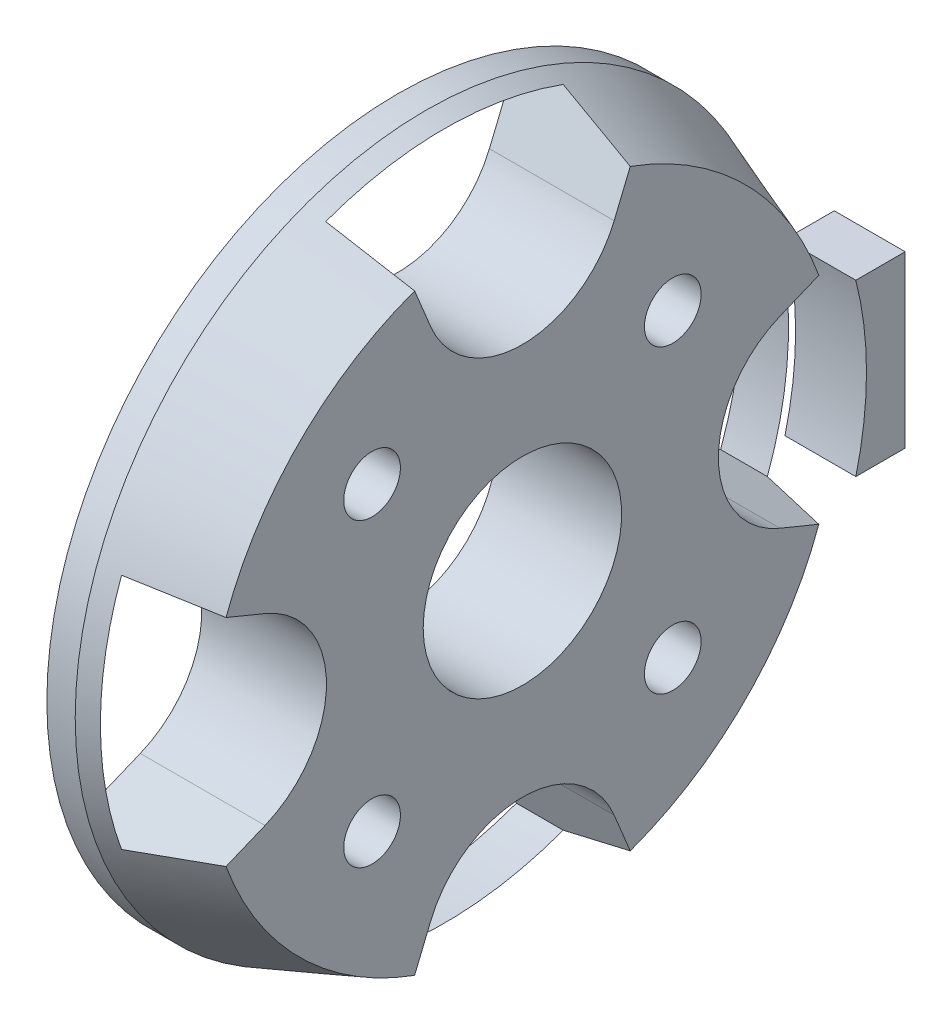
ISO-10303-21;
HEADER;
FILE_DESCRIPTION(('STEP AP214'),'2;1');
FILE_NAME('part.step','',(''),(''),'','','');
FILE_SCHEMA(('AUTOMOTIVE_DESIGN { 1 0 10303 214 1 1 1 1 }'));
ENDSEC;
DATA;
#1=APPLICATION_CONTEXT('core data for automotive mechanical design processes');
#2=APPLICATION_PROTOCOL_DEFINITION('international standard','automotive_design',2000,#1);
#3=PRODUCT_CONTEXT('',#1,'mechanical');
#4=PRODUCT('Part','Part','',(#3));
#5=PRODUCT_RELATED_PRODUCT_CATEGORY('part','',(#4));
#6=PRODUCT_DEFINITION_FORMATION('','',#4);
#7=PRODUCT_DEFINITION_CONTEXT('part definition',#1,'design');
#8=PRODUCT_DEFINITION('design','',#6,#7);
#9=PRODUCT_DEFINITION_SHAPE('','',#8);
#10=(LENGTH_UNIT() NAMED_UNIT(*) SI_UNIT(.MILLI.,.METRE.));
#11=(NAMED_UNIT(*) PLANE_ANGLE_UNIT() SI_UNIT($,.RADIAN.));
#12=(NAMED_UNIT(*) SI_UNIT($,.STERADIAN.) SOLID_ANGLE_UNIT());
#13=UNCERTAINTY_MEASURE_WITH_UNIT(LENGTH_MEASURE(1.E-05),#10,'distance_accuracy_value','');
#14=(GEOMETRIC_REPRESENTATION_CONTEXT(3) GLOBAL_UNCERTAINTY_ASSIGNED_CONTEXT((#13)) GLOBAL_UNIT_ASSIGNED_CONTEXT((#10,
#11,#12)) REPRESENTATION_CONTEXT('',''));
#15=CARTESIAN_POINT('',(0.,0.,0.));
#16=DIRECTION('',(0.,0.,1.));
#17=DIRECTION('',(1.,0.,0.));
#18=AXIS2_PLACEMENT_3D('',#15,#16,#17);
#19=CARTESIAN_POINT('',(0.,7.,0.));
#20=DIRECTION('',(1.,0.,0.));
#21=DIRECTION('',(0.,0.,-1.));
#22=AXIS2_PLACEMENT_3D('',#19,#20,#21);
#23=PLANE('',#22);
#24=DIRECTION('',(0.,0.38090446323325,-0.9246144006498));
#25=VECTOR('',#24,1.);
#26=CARTESIAN_POINT('',(0.,-7.60601927752442,20.909590401295));
#27=LINE('',#26,#25);
#28=CARTESIAN_POINT('',(0.,-8.37682312071493,22.7806536265471));
#29=VERTEX_POINT('',#28);
#30=CARTESIAN_POINT('',(0.,-6.47230080454868,18.1575816232981));
#31=VERTEX_POINT('',#30);
#32=EDGE_CURVE('E579',#29,#31,#27,.T.);
#33=ORIENTED_EDGE('',*,*,#32,.T.);
#34=CARTESIAN_POINT('',(0.,0.,20.8239128659309));
#35=DIRECTION('',(1.,0.,0.));
#36=DIRECTION('',(0.,1.,0.));
#37=AXIS2_PLACEMENT_3D('',#34,#35,#36);
#38=CIRCLE('',#37,7.);
#39=CARTESIAN_POINT('',(0.,6.47230080454855,18.1575816232982));
#40=VERTEX_POINT('',#39);
#41=EDGE_CURVE('E392',#31,#40,#38,.T.);
#42=ORIENTED_EDGE('',*,*,#41,.T.);
#43=DIRECTION('',(0.,0.380904463233244,0.924614400649803));
#44=VECTOR('',#43,1.);
#45=CARTESIAN_POINT('',(0.,6.47230080454855,18.1575816232982));
#46=LINE('',#45,#44);
#47=CARTESIAN_POINT('',(0.,8.37682312071477,22.7806536265472));
#48=VERTEX_POINT('',#47);
#49=EDGE_CURVE('E582',#40,#48,#46,.T.);
#50=ORIENTED_EDGE('',*,*,#49,.T.);
#51=CARTESIAN_POINT('',(0.,0.,0.));
#52=DIRECTION('',(1.,0.,0.));
#53=DIRECTION('',(0.,1.,0.));
#54=AXIS2_PLACEMENT_3D('',#51,#52,#53);
#55=CIRCLE('',#54,24.2719868417989);
#56=EDGE_CURVE('E534',#48,#29,#55,.T.);
#57=ORIENTED_EDGE('',*,*,#56,.T.);
#58=EDGE_LOOP('',(#33,#42,#50,#57));
#59=FACE_BOUND('',#58,.T.);
#60=DIRECTION('',(0.,0.924614400649802,0.380904463233247));
#61=VECTOR('',#60,1.);
#62=CARTESIAN_POINT('',(0.,-20.909590401295,-7.60601927752435));
#63=LINE('',#62,#61);
#64=CARTESIAN_POINT('',(0.,-22.7806536265472,-8.37682312071485));
#65=VERTEX_POINT('',#64);
#66=CARTESIAN_POINT('',(0.,-18.1575816232982,-6.47230080454862));
#67=VERTEX_POINT('',#66);
#68=EDGE_CURVE('E567',#65,#67,#63,.T.);
#69=ORIENTED_EDGE('',*,*,#68,.T.);
#70=CARTESIAN_POINT('',(0.,-20.8239128659309,0.));
#71=DIRECTION('',(1.,0.,0.));
#72=DIRECTION('',(0.,0.,1.));
#73=AXIS2_PLACEMENT_3D('',#70,#71,#72);
#74=CIRCLE('',#73,7.);
#75=CARTESIAN_POINT('',(0.,-18.1575816232982,6.47230080454861));
#76=VERTEX_POINT('',#75);
#77=EDGE_CURVE('E565',#67,#76,#74,.T.);
#78=ORIENTED_EDGE('',*,*,#77,.T.);
#79=DIRECTION('',(0.,-0.924614400649801,0.380904463233247));
#80=VECTOR('',#79,1.);
#81=CARTESIAN_POINT('',(0.,-18.1575816232982,6.47230080454861));
#82=LINE('',#81,#80);
#83=CARTESIAN_POINT('',(0.,-22.7806536265472,8.37682312071485));
#84=VERTEX_POINT('',#83);
#85=EDGE_CURVE('E552',#76,#84,#82,.T.);
#86=ORIENTED_EDGE('',*,*,#85,.T.);
#87=CARTESIAN_POINT('',(0.,0.,0.));
#88=DIRECTION('',(1.,0.,0.));
#89=DIRECTION('',(0.,0.,1.));
#90=AXIS2_PLACEMENT_3D('',#87,#88,#89);
#91=CIRCLE('',#90,24.2719868417989);
#92=EDGE_CURVE('E540',#84,#65,#91,.T.);
#93=ORIENTED_EDGE('',*,*,#92,.T.);
#94=EDGE_LOOP('',(#69,#78,#86,#93));
#95=FACE_BOUND('',#94,.T.);
#96=DIRECTION('',(0.,-0.380904463233256,0.924614400649798));
#97=VECTOR('',#96,1.);
#98=CARTESIAN_POINT('',(0.,7.60601927752457,-20.9095904012949));
#99=LINE('',#98,#97);
#100=CARTESIAN_POINT('',(0.,8.37682312071509,-22.7806536265471));
#101=VERTEX_POINT('',#100);
#102=CARTESIAN_POINT('',(0.,6.4723008045488,-18.1575816232981));
#103=VERTEX_POINT('',#102);
#104=EDGE_CURVE('E551',#101,#103,#99,.T.);
#105=ORIENTED_EDGE('',*,*,#104,.T.);
#106=CARTESIAN_POINT('',(0.,2.18118909519279E-13,-20.8239128659309));
#107=DIRECTION('',(1.,0.,0.));
#108=DIRECTION('',(0.,-1.,0.));
#109=AXIS2_PLACEMENT_3D('',#106,#107,#108);
#110=CIRCLE('',#109,7.);
#111=CARTESIAN_POINT('',(0.,-6.47230080454842,-18.1575816232982));
#112=VERTEX_POINT('',#111);
#113=EDGE_CURVE('E791',#103,#112,#110,.T.);
#114=ORIENTED_EDGE('',*,*,#113,.T.);
#115=DIRECTION('',(0.,-0.380904463233238,-0.924614400649805));
#116=VECTOR('',#115,1.);
#117=CARTESIAN_POINT('',(0.,-6.47230080454842,-18.1575816232982));
#118=LINE('',#117,#116);
#119=CARTESIAN_POINT('',(0.,-8.37682312071461,-22.7806536265473));
#120=VERTEX_POINT('',#119);
#121=EDGE_CURVE('E796',#112,#120,#118,.T.);
#122=ORIENTED_EDGE('',*,*,#121,.T.);
#123=CARTESIAN_POINT('',(0.,0.,0.));
#124=DIRECTION('',(1.,0.,0.));
#125=DIRECTION('',(0.,-1.,0.));
#126=AXIS2_PLACEMENT_3D('',#123,#124,#125);
#127=CIRCLE('',#126,24.2719868417989);
#128=EDGE_CURVE('E792',#120,#101,#127,.T.);
#129=ORIENTED_EDGE('',*,*,#128,.T.);
#130=EDGE_LOOP('',(#105,#114,#122,#129));
#131=FACE_BOUND('',#130,.T.);
#132=DIRECTION('',(0.,-0.924614400649802,-0.380904463233247));
#133=VECTOR('',#132,1.);
#134=CARTESIAN_POINT('',(0.,20.909590401295,7.60601927752435));
#135=LINE('',#134,#133);
#136=CARTESIAN_POINT('',(0.,22.7806536265472,8.37682312071485));
#137=VERTEX_POINT('',#136);
#138=CARTESIAN_POINT('',(0.,18.1575816232982,6.47230080454862));
#139=VERTEX_POINT('',#138);
#140=EDGE_CURVE('E795',#137,#139,#135,.T.);
#141=ORIENTED_EDGE('',*,*,#140,.T.);
#142=CARTESIAN_POINT('',(0.,20.8239128659309,0.));
#143=DIRECTION('',(1.,0.,0.));
#144=DIRECTION('',(0.,0.,-1.));
#145=AXIS2_PLACEMENT_3D('',#142,#143,#144);
#146=CIRCLE('',#145,7.);
#147=CARTESIAN_POINT('',(0.,18.1575816232982,-6.47230080454861));
#148=VERTEX_POINT('',#147);
#149=EDGE_CURVE('E1165',#139,#148,#146,.T.);
#150=ORIENTED_EDGE('',*,*,#149,.T.);
#151=DIRECTION('',(0.,0.924614400649801,-0.380904463233247));
#152=VECTOR('',#151,1.);
#153=CARTESIAN_POINT('',(0.,18.1575816232982,-6.47230080454861));
#154=LINE('',#153,#152);
#155=CARTESIAN_POINT('',(0.,22.7806536265472,-8.37682312071485));
#156=VERTEX_POINT('',#155);
#157=EDGE_CURVE('E1169',#148,#156,#154,.T.);
#158=ORIENTED_EDGE('',*,*,#157,.T.);
#159=CARTESIAN_POINT('',(0.,0.,0.));
#160=DIRECTION('',(1.,0.,0.));
#161=DIRECTION('',(0.,0.,-1.));
#162=AXIS2_PLACEMENT_3D('',#159,#160,#161);
#163=CIRCLE('',#162,24.2719868417989);
#164=EDGE_CURVE('E682',#156,#137,#163,.T.);
#165=ORIENTED_EDGE('',*,*,#164,.T.);
#166=EDGE_LOOP('',(#141,#150,#158,#165));
#167=FACE_BOUND('',#166,.T.);
#168=CARTESIAN_POINT('',(0.,0.,0.));
#169=DIRECTION('',(-1.,0.,0.));
#170=DIRECTION('',(0.,0.,1.));
#171=AXIS2_PLACEMENT_3D('',#168,#169,#170);
#172=CIRCLE('',#171,7.);
#173=CARTESIAN_POINT('',(0.,0.,7.));
#174=VERTEX_POINT('',#173);
#175=EDGE_CURVE('E689',#174,#174,#172,.T.);
#176=ORIENTED_EDGE('',*,*,#175,.F.);
#177=EDGE_LOOP('',(#176));
#178=FACE_BOUND('',#177,.T.);
#179=CARTESIAN_POINT('',(0.,0.,0.));
#180=DIRECTION('',(-1.,0.,0.));
#181=DIRECTION('',(0.,0.,1.));
#182=AXIS2_PLACEMENT_3D('',#179,#180,#181);
#183=CIRCLE('',#182,24.75);
#184=CARTESIAN_POINT('',(0.,0.,24.75));
#185=VERTEX_POINT('',#184);
#186=EDGE_CURVE('E672',#185,#185,#183,.T.);
#187=ORIENTED_EDGE('',*,*,#186,.T.);
#188=EDGE_LOOP('',(#187));
#189=FACE_BOUND('',#188,.T.);
#190=ADVANCED_FACE('F388',(#59,#95,#131,#167,#178,#189),#23,.F.);
#191=CARTESIAN_POINT('',(0.,0.,0.));
#192=DIRECTION('',(-1.,0.,0.));
#193=DIRECTION('',(0.,0.,1.));
#194=AXIS2_PLACEMENT_3D('',#191,#192,#193);
#195=CYLINDRICAL_SURFACE('',#194,24.75);
#196=ORIENTED_EDGE('',*,*,#186,.F.);
#197=EDGE_LOOP('',(#196));
#198=FACE_BOUND('',#197,.T.);
#199=CARTESIAN_POINT('',(2.,0.,0.));
#200=DIRECTION('',(-1.,0.,0.));
#201=DIRECTION('',(0.,0.,1.));
#202=AXIS2_PLACEMENT_3D('',#199,#200,#201);
#203=CIRCLE('',#202,24.75);
#204=CARTESIAN_POINT('',(2.,0.,24.75));
#205=VERTEX_POINT('',#204);
#206=EDGE_CURVE('E675',#205,#205,#203,.T.);
#207=ORIENTED_EDGE('',*,*,#206,.T.);
#208=EDGE_LOOP('',(#207));
#209=FACE_BOUND('',#208,.T.);
#210=ADVANCED_FACE('F660',(#198,#209),#195,.T.);
#211=CARTESIAN_POINT('',(8.8,0.,0.));
#212=DIRECTION('',(-1.,0.,0.));
#213=DIRECTION('',(0.,0.,1.));
#214=AXIS2_PLACEMENT_3D('',#211,#212,#213);
#215=CONICAL_SURFACE('',#214,22.25,0.352308724674142);
#216=CARTESIAN_POINT('',(8.8,0.,0.));
#217=DIRECTION('',(-1.,0.,0.));
#218=DIRECTION('',(0.,0.,1.));
#219=AXIS2_PLACEMENT_3D('',#216,#217,#218);
#220=CIRCLE('',#219,22.25);
#221=CARTESIAN_POINT('',(8.8,-20.909590401295,7.60601927752435));
#222=VERTEX_POINT('',#221);
#223=CARTESIAN_POINT('',(8.8,-7.60601927752443,20.909590401295));
#224=VERTEX_POINT('',#223);
#225=EDGE_CURVE('E614',#222,#224,#220,.T.);
#226=ORIENTED_EDGE('',*,*,#225,.T.);
#227=CARTESIAN_POINT('',(8.8002,-7.60599124524422,20.9095223552297));
#228=CARTESIAN_POINT('',(7.8834422989556,-7.73448487995542,21.221430133987));
#229=CARTESIAN_POINT('',(6.96668077099402,-7.86297455293962,21.5333282959763));
#230=CARTESIAN_POINT('',(5.13315006124676,-8.11994597545255,22.1571053864154));
#231=CARTESIAN_POINT('',(4.21638087946108,-8.24842772498128,22.4689843148653));
#232=CARTESIAN_POINT('',(3.29960787075822,-8.37690551278301,22.7808536265471));
#233=B_SPLINE_CURVE_WITH_KNOTS('',3,(#227,#228,#229,#230,#231,#232),.UNSPECIFIED.,.F.,.F.,(4,2,
4),(0.,2.93055896169946,5.86111792336612),.UNSPECIFIED.);
#234=CARTESIAN_POINT('',(3.30019579030695,-8.37682312071493,22.7806536265471));
#235=VERTEX_POINT('',#234);
#236=EDGE_CURVE('E616',#224,#235,#233,.T.);
#237=ORIENTED_EDGE('',*,*,#236,.T.);
#238=CARTESIAN_POINT('',(3.30019579030695,0.,0.));
#239=DIRECTION('',(-1.,0.,0.));
#240=DIRECTION('',(0.,0.,1.));
#241=AXIS2_PLACEMENT_3D('',#238,#239,#240);
#242=CIRCLE('',#241,24.2719868417989);
#243=CARTESIAN_POINT('',(3.30019579030694,8.37682312071477,22.7806536265472));
#244=VERTEX_POINT('',#243);
#245=EDGE_CURVE('E610',#235,#244,#242,.T.);
#246=ORIENTED_EDGE('',*,*,#245,.T.);
#247=CARTESIAN_POINT('',(3.29960787075824,8.37690551278286,22.7808536265472));
#248=CARTESIAN_POINT('',(4.2163808794611,8.24842772498113,22.4689843148653));
#249=CARTESIAN_POINT('',(5.13315006124678,8.1199459754524,22.1571053864155));
#250=CARTESIAN_POINT('',(6.96668077099403,7.86297455293947,21.5333282959763));
#251=CARTESIAN_POINT('',(7.8834422989556,7.73448487995528,21.221430133987));
#252=CARTESIAN_POINT('',(8.8002,7.60599124524408,20.9095223552298));
#253=B_SPLINE_CURVE_WITH_KNOTS('',3,(#247,#248,#249,#250,#251,#252),.UNSPECIFIED.,.F.,.F.,(4,2,
4),(0.,2.93055896166666,5.8611179233661),.UNSPECIFIED.);
#254=CARTESIAN_POINT('',(8.8,7.60601927752428,20.909590401295));
#255=VERTEX_POINT('',#254);
#256=EDGE_CURVE('E602',#244,#255,#253,.T.);
#257=ORIENTED_EDGE('',*,*,#256,.T.);
#258=CARTESIAN_POINT('',(8.8,20.909590401295,7.60601927752435));
#259=VERTEX_POINT('',#258);
#260=EDGE_CURVE('E598',#255,#259,#220,.T.);
#261=ORIENTED_EDGE('',*,*,#260,.T.);
#262=CARTESIAN_POINT('',(8.8002,20.9095223552297,7.60599124524415));
#263=CARTESIAN_POINT('',(7.8834422989556,21.221430133987,7.73448487995535));
#264=CARTESIAN_POINT('',(6.96668077099402,21.5333282959763,7.86297455293954));
#265=CARTESIAN_POINT('',(5.13315006124676,22.1571053864155,8.11994597545247));
#266=CARTESIAN_POINT('',(4.21638087946108,22.4689843148653,8.24842772498121));
#267=CARTESIAN_POINT('',(3.29960787075822,22.7808536265472,8.37690551278293));
#268=B_SPLINE_CURVE_WITH_KNOTS('',3,(#262,#263,#264,#265,#266,#267),.UNSPECIFIED.,.F.,.F.,(4,2,
4),(0.,2.93055896169946,5.86111792336612),.UNSPECIFIED.);
#269=CARTESIAN_POINT('',(3.30019579030695,22.7806536265472,8.37682312071485));
#270=VERTEX_POINT('',#269);
#271=EDGE_CURVE('E612',#259,#270,#268,.T.);
#272=ORIENTED_EDGE('',*,*,#271,.T.);
#273=CARTESIAN_POINT('',(3.30019579030695,0.,0.));
#274=DIRECTION('',(-1.,0.,0.));
#275=DIRECTION('',(0.,0.,1.));
#276=AXIS2_PLACEMENT_3D('',#273,#274,#275);
#277=CIRCLE('',#276,24.2719868417989);
#278=CARTESIAN_POINT('',(3.30019579030694,22.7806536265472,-8.37682312071485));
#279=VERTEX_POINT('',#278);
#280=EDGE_CURVE('E726',#270,#279,#277,.T.);
#281=ORIENTED_EDGE('',*,*,#280,.T.);
#282=CARTESIAN_POINT('',(3.29960787075824,22.7808536265472,-8.37690551278294));
#283=CARTESIAN_POINT('',(4.2163808794611,22.4689843148653,-8.24842772498121));
#284=CARTESIAN_POINT('',(5.13315006124677,22.1571053864155,-8.11994597545247));
#285=CARTESIAN_POINT('',(6.96668077099403,21.5333282959763,-7.86297455293954));
#286=CARTESIAN_POINT('',(7.8834422989556,21.221430133987,-7.73448487995535));
#287=CARTESIAN_POINT('',(8.8002,20.9095223552297,-7.60599124524415));
#288=B_SPLINE_CURVE_WITH_KNOTS('',3,(#282,#283,#284,#285,#286,#287),.UNSPECIFIED.,.F.,.F.,(4,2,
4),(0.,2.93055896166666,5.86111792336611),.UNSPECIFIED.);
#289=CARTESIAN_POINT('',(8.8,20.909590401295,-7.60601927752435));
#290=VERTEX_POINT('',#289);
#291=EDGE_CURVE('E727',#279,#290,#288,.T.);
#292=ORIENTED_EDGE('',*,*,#291,.T.);
#293=CARTESIAN_POINT('',(8.8,7.60601927752457,-20.9095904012949));
#294=VERTEX_POINT('',#293);
#295=EDGE_CURVE('E615',#290,#294,#220,.T.);
#296=ORIENTED_EDGE('',*,*,#295,.T.);
#297=CARTESIAN_POINT('',(8.8002,7.60599124524436,-20.9095223552297));
#298=CARTESIAN_POINT('',(7.8834422989556,7.73448487995557,-21.2214301339869));
#299=CARTESIAN_POINT('',(6.96668077099403,7.86297455293977,-21.5333282959762));
#300=CARTESIAN_POINT('',(5.13315006124677,8.1199459754527,-22.1571053864154));
#301=CARTESIAN_POINT('',(4.21638087946109,8.24842772498144,-22.4689843148652));
#302=CARTESIAN_POINT('',(3.29960787075823,8.37690551278317,-22.7808536265471));
#303=B_SPLINE_CURVE_WITH_KNOTS('',3,(#297,#298,#299,#300,#301,#302),.UNSPECIFIED.,.F.,.F.,(4,2,
4),(0.,2.93055896169946,5.86111792336612),.UNSPECIFIED.);
#304=CARTESIAN_POINT('',(3.30019579030695,8.37682312071509,-22.7806536265471));
#305=VERTEX_POINT('',#304);
#306=EDGE_CURVE('E764',#294,#305,#303,.T.);
#307=ORIENTED_EDGE('',*,*,#306,.T.);
#308=CARTESIAN_POINT('',(3.30019579030695,0.,0.));
#309=DIRECTION('',(-1.,0.,0.));
#310=DIRECTION('',(0.,0.,1.));
#311=AXIS2_PLACEMENT_3D('',#308,#309,#310);
#312=CIRCLE('',#311,24.2719868417989);
#313=CARTESIAN_POINT('',(3.30019579030695,-8.37682312071462,-22.7806536265473));
#314=VERTEX_POINT('',#313);
#315=EDGE_CURVE('E763',#305,#314,#312,.T.);
#316=ORIENTED_EDGE('',*,*,#315,.T.);
#317=CARTESIAN_POINT('',(3.29960787075824,-8.3769055127827,-22.7808536265473));
#318=CARTESIAN_POINT('',(4.2163808794611,-8.24842772498097,-22.4689843148654));
#319=CARTESIAN_POINT('',(5.13315006124677,-8.11994597545224,-22.1571053864155));
#320=CARTESIAN_POINT('',(6.96668077099403,-7.86297455293932,-21.5333282959764));
#321=CARTESIAN_POINT('',(7.8834422989556,-7.73448487995513,-21.2214301339871));
#322=CARTESIAN_POINT('',(8.8002,-7.60599124524393,-20.9095223552298));
#323=B_SPLINE_CURVE_WITH_KNOTS('',3,(#317,#318,#319,#320,#321,#322),.UNSPECIFIED.,.F.,.F.,(4,2,
4),(0.,2.93055896166666,5.8611179233661),.UNSPECIFIED.);
#324=CARTESIAN_POINT('',(8.8,-7.60601927752414,-20.9095904012951));
#325=VERTEX_POINT('',#324);
#326=EDGE_CURVE('E755',#314,#325,#323,.T.);
#327=ORIENTED_EDGE('',*,*,#326,.T.);
#328=CARTESIAN_POINT('',(8.8,-20.909590401295,-7.60601927752435));
#329=VERTEX_POINT('',#328);
#330=EDGE_CURVE('E680',#325,#329,#220,.T.);
#331=ORIENTED_EDGE('',*,*,#330,.T.);
#332=CARTESIAN_POINT('',(8.8002,-20.9095223552297,-7.60599124524415));
#333=CARTESIAN_POINT('',(7.8834422989556,-21.221430133987,-7.73448487995535));
#334=CARTESIAN_POINT('',(6.96668077099402,-21.5333282959763,-7.86297455293954));
#335=CARTESIAN_POINT('',(5.13315006124676,-22.1571053864155,-8.11994597545247));
#336=CARTESIAN_POINT('',(4.21638087946108,-22.4689843148653,-8.24842772498121));
#337=CARTESIAN_POINT('',(3.29960787075822,-22.7808536265472,-8.37690551278293));
#338=B_SPLINE_CURVE_WITH_KNOTS('',3,(#332,#333,#334,#335,#336,#337),.UNSPECIFIED.,.F.,.F.,(4,2,
4),(0.,2.93055896169946,5.86111792336612),.UNSPECIFIED.);
#339=CARTESIAN_POINT('',(3.30019579030695,-22.7806536265472,-8.37682312071485));
#340=VERTEX_POINT('',#339);
#341=EDGE_CURVE('E632',#329,#340,#338,.T.);
#342=ORIENTED_EDGE('',*,*,#341,.T.);
#343=CARTESIAN_POINT('',(3.30019579030695,0.,0.));
#344=DIRECTION('',(-1.,0.,0.));
#345=DIRECTION('',(0.,0.,1.));
#346=AXIS2_PLACEMENT_3D('',#343,#344,#345);
#347=CIRCLE('',#346,24.2719868417989);
#348=CARTESIAN_POINT('',(3.30019579030694,-22.7806536265472,8.37682312071485));
#349=VERTEX_POINT('',#348);
#350=EDGE_CURVE('E817',#340,#349,#347,.T.);
#351=ORIENTED_EDGE('',*,*,#350,.T.);
#352=CARTESIAN_POINT('',(3.29960787075824,-22.7808536265472,8.37690551278294));
#353=CARTESIAN_POINT('',(4.2163808794611,-22.4689843148653,8.24842772498121));
#354=CARTESIAN_POINT('',(5.13315006124677,-22.1571053864155,8.11994597545247));
#355=CARTESIAN_POINT('',(6.96668077099403,-21.5333282959763,7.86297455293954));
#356=CARTESIAN_POINT('',(7.8834422989556,-21.221430133987,7.73448487995535));
#357=CARTESIAN_POINT('',(8.8002,-20.9095223552297,7.60599124524415));
#358=B_SPLINE_CURVE_WITH_KNOTS('',3,(#352,#353,#354,#355,#356,#357),.UNSPECIFIED.,.F.,.F.,(4,2,
4),(0.,2.93055896166666,5.86111792336611),.UNSPECIFIED.);
#359=EDGE_CURVE('E560',#349,#222,#358,.T.);
#360=ORIENTED_EDGE('',*,*,#359,.T.);
#361=EDGE_LOOP('',(#226,#237,#246,#257,#261,#272,#281,#292,#296,#307,#316,#327,#331,#342,#351,#360));
#362=FACE_BOUND('',#361,.T.);
#363=ORIENTED_EDGE('',*,*,#206,.F.);
#364=EDGE_LOOP('',(#363));
#365=FACE_BOUND('',#364,.T.);
#366=ADVANCED_FACE('F605',(#362,#365),#215,.T.);
#367=CARTESIAN_POINT('',(8.8,22.25,0.));
#368=DIRECTION('',(-1.,0.,0.));
#369=DIRECTION('',(0.,0.,1.));
#370=AXIS2_PLACEMENT_3D('',#367,#368,#369);
#371=PLANE('',#370);
#372=CARTESIAN_POINT('',(8.8,0.,20.8239128659309));
#373=DIRECTION('',(1.,0.,0.));
#374=DIRECTION('',(0.,1.,0.));
#375=AXIS2_PLACEMENT_3D('',#372,#373,#374);
#376=CIRCLE('',#375,7.);
#377=CARTESIAN_POINT('',(8.8,-6.47230080454868,18.1575816232981));
#378=VERTEX_POINT('',#377);
#379=CARTESIAN_POINT('',(8.8,6.47230080454855,18.1575816232982));
#380=VERTEX_POINT('',#379);
#381=EDGE_CURVE('E397',#378,#380,#376,.T.);
#382=ORIENTED_EDGE('',*,*,#381,.F.);
#383=DIRECTION('',(0.,-0.38090446323325,0.9246144006498));
#384=VECTOR('',#383,1.);
#385=CARTESIAN_POINT('',(8.8,4.08988057786929,-7.48124897890094));
#386=LINE('',#385,#384);
#387=EDGE_CURVE('E594',#378,#224,#386,.T.);
#388=ORIENTED_EDGE('',*,*,#387,.T.);
#389=ORIENTED_EDGE('',*,*,#225,.F.);
#390=DIRECTION('',(0.,-0.924614400649801,0.380904463233248));
#391=VECTOR('',#390,1.);
#392=CARTESIAN_POINT('',(8.8,-20.909590401295,7.60601927752435));
#393=LINE('',#392,#391);
#394=CARTESIAN_POINT('',(8.8,-18.1575816232982,6.47230080454861));
#395=VERTEX_POINT('',#394);
#396=EDGE_CURVE('E802',#395,#222,#393,.T.);
#397=ORIENTED_EDGE('',*,*,#396,.F.);
#398=CARTESIAN_POINT('',(8.8,-20.8239128659309,0.));
#399=DIRECTION('',(1.,0.,0.));
#400=DIRECTION('',(0.,0.,1.));
#401=AXIS2_PLACEMENT_3D('',#398,#399,#400);
#402=CIRCLE('',#401,7.);
#403=CARTESIAN_POINT('',(8.8,-18.1575816232982,-6.47230080454862));
#404=VERTEX_POINT('',#403);
#405=EDGE_CURVE('E807',#404,#395,#402,.T.);
#406=ORIENTED_EDGE('',*,*,#405,.F.);
#407=DIRECTION('',(0.,-0.924614400649802,-0.380904463233247));
#408=VECTOR('',#407,1.);
#409=CARTESIAN_POINT('',(8.8,18.6668143224373,8.69788988439297));
#410=LINE('',#409,#408);
#411=EDGE_CURVE('E813',#404,#329,#410,.T.);
#412=ORIENTED_EDGE('',*,*,#411,.T.);
#413=ORIENTED_EDGE('',*,*,#330,.F.);
#414=DIRECTION('',(0.,-0.380904463233238,-0.924614400649805));
#415=VECTOR('',#414,1.);
#416=CARTESIAN_POINT('',(8.8,-7.60601927752413,-20.9095904012951));
#417=LINE('',#416,#415);
#418=CARTESIAN_POINT('',(8.8,-6.47230080454842,-18.1575816232982));
#419=VERTEX_POINT('',#418);
#420=EDGE_CURVE('E774',#419,#325,#417,.T.);
#421=ORIENTED_EDGE('',*,*,#420,.F.);
#422=CARTESIAN_POINT('',(8.8,2.18118909519279E-13,-20.8239128659309));
#423=DIRECTION('',(1.,0.,0.));
#424=DIRECTION('',(0.,-1.,0.));
#425=AXIS2_PLACEMENT_3D('',#422,#423,#424);
#426=CIRCLE('',#425,7.);
#427=CARTESIAN_POINT('',(8.8,6.4723008045488,-18.1575816232981));
#428=VERTEX_POINT('',#427);
#429=EDGE_CURVE('E779',#428,#419,#426,.T.);
#430=ORIENTED_EDGE('',*,*,#429,.F.);
#431=DIRECTION('',(0.,-0.380904463233257,0.924614400649798));
#432=VECTOR('',#431,1.);
#433=CARTESIAN_POINT('',(8.8,6.4723008045488,-18.1575816232981));
#434=LINE('',#433,#432);
#435=EDGE_CURVE('E782',#294,#428,#434,.T.);
#436=ORIENTED_EDGE('',*,*,#435,.F.);
#437=ORIENTED_EDGE('',*,*,#295,.F.);
#438=DIRECTION('',(0.,0.924614400649801,-0.380904463233248));
#439=VECTOR('',#438,1.);
#440=CARTESIAN_POINT('',(8.8,20.909590401295,-7.60601927752435));
#441=LINE('',#440,#439);
#442=CARTESIAN_POINT('',(8.8,18.1575816232982,-6.47230080454861));
#443=VERTEX_POINT('',#442);
#444=EDGE_CURVE('E1181',#443,#290,#441,.T.);
#445=ORIENTED_EDGE('',*,*,#444,.F.);
#446=CARTESIAN_POINT('',(8.8,20.8239128659309,0.));
#447=DIRECTION('',(1.,0.,0.));
#448=DIRECTION('',(0.,0.,-1.));
#449=AXIS2_PLACEMENT_3D('',#446,#447,#448);
#450=CIRCLE('',#449,7.);
#451=CARTESIAN_POINT('',(8.8,18.1575816232982,6.47230080454862));
#452=VERTEX_POINT('',#451);
#453=EDGE_CURVE('E1178',#452,#443,#450,.T.);
#454=ORIENTED_EDGE('',*,*,#453,.F.);
#455=DIRECTION('',(0.,0.924614400649802,0.380904463233247));
#456=VECTOR('',#455,1.);
#457=CARTESIAN_POINT('',(8.8,19.3767603276228,6.97455407859435));
#458=LINE('',#457,#456);
#459=EDGE_CURVE('E690',#452,#259,#458,.T.);
#460=ORIENTED_EDGE('',*,*,#459,.T.);
#461=ORIENTED_EDGE('',*,*,#260,.F.);
#462=DIRECTION('',(0.,0.380904463233245,0.924614400649803));
#463=VECTOR('',#462,1.);
#464=CARTESIAN_POINT('',(8.8,7.60601927752428,20.909590401295));
#465=LINE('',#464,#463);
#466=EDGE_CURVE('E572',#380,#255,#465,.T.);
#467=ORIENTED_EDGE('',*,*,#466,.F.);
#468=EDGE_LOOP('',(#382,#388,#389,#397,#406,#412,#413,#421,#430,#436,#437,#445,#454,#460,#461,#467));
#469=FACE_BOUND('',#468,.T.);
#470=CARTESIAN_POINT('',(8.8,10.6066017177976,10.6066017177982));
#471=DIRECTION('',(1.,0.,0.));
#472=DIRECTION('',(0.,0.,-1.));
#473=AXIS2_PLACEMENT_3D('',#470,#471,#472);
#474=CIRCLE('',#473,2.00000000000064);
#475=CARTESIAN_POINT('',(8.8,10.6066017177976,8.60660171779759));
#476=VERTEX_POINT('',#475);
#477=EDGE_CURVE('E705',#476,#476,#474,.T.);
#478=ORIENTED_EDGE('',*,*,#477,.F.);
#479=EDGE_LOOP('',(#478));
#480=FACE_BOUND('',#479,.T.);
#481=CARTESIAN_POINT('',(8.8,-10.6066017177988,10.6066017177976));
#482=DIRECTION('',(1.,0.,0.));
#483=DIRECTION('',(0.,0.,-1.));
#484=AXIS2_PLACEMENT_3D('',#481,#482,#483);
#485=CIRCLE('',#484,2.00000000000045);
#486=CARTESIAN_POINT('',(8.8,-10.6066017177988,8.60660171779715));
#487=VERTEX_POINT('',#486);
#488=EDGE_CURVE('E711',#487,#487,#485,.T.);
#489=ORIENTED_EDGE('',*,*,#488,.F.);
#490=EDGE_LOOP('',(#489));
#491=FACE_BOUND('',#490,.T.);
#492=CARTESIAN_POINT('',(8.8,-10.6066017177982,-10.6066017177988));
#493=DIRECTION('',(1.,0.,0.));
#494=DIRECTION('',(0.,0.,-1.));
#495=AXIS2_PLACEMENT_3D('',#492,#493,#494);
#496=CIRCLE('',#495,1.99999999999985);
#497=CARTESIAN_POINT('',(8.8,-10.6066017177982,-12.6066017177987));
#498=VERTEX_POINT('',#497);
#499=EDGE_CURVE('E700',#498,#498,#496,.T.);
#500=ORIENTED_EDGE('',*,*,#499,.F.);
#501=EDGE_LOOP('',(#500));
#502=FACE_BOUND('',#501,.T.);
#503=CARTESIAN_POINT('',(8.8,10.6066017177982,-10.6066017177982));
#504=DIRECTION('',(1.,0.,0.));
#505=DIRECTION('',(0.,0.,-1.));
#506=AXIS2_PLACEMENT_3D('',#503,#504,#505);
#507=CIRCLE('',#506,2.);
#508=CARTESIAN_POINT('',(8.8,10.6066017177982,-12.6066017177982));
#509=VERTEX_POINT('',#508);
#510=EDGE_CURVE('E693',#509,#509,#507,.T.);
#511=ORIENTED_EDGE('',*,*,#510,.F.);
#512=EDGE_LOOP('',(#511));
#513=FACE_BOUND('',#512,.T.);
#514=CARTESIAN_POINT('',(8.8,0.,0.));
#515=DIRECTION('',(-1.,0.,0.));
#516=DIRECTION('',(0.,0.,1.));
#517=AXIS2_PLACEMENT_3D('',#514,#515,#516);
#518=CIRCLE('',#517,7.);
#519=CARTESIAN_POINT('',(8.8,0.,7.));
#520=VERTEX_POINT('',#519);
#521=EDGE_CURVE('E686',#520,#520,#518,.T.);
#522=ORIENTED_EDGE('',*,*,#521,.T.);
#523=EDGE_LOOP('',(#522));
#524=FACE_BOUND('',#523,.T.);
#525=ADVANCED_FACE('F591',(#469,#480,#491,#502,#513,#524),#371,.F.);
#526=CARTESIAN_POINT('',(0.,0.,0.));
#527=DIRECTION('',(-1.,0.,0.));
#528=DIRECTION('',(0.,0.,1.));
#529=AXIS2_PLACEMENT_3D('',#526,#527,#528);
#530=CYLINDRICAL_SURFACE('',#529,7.);
#531=ORIENTED_EDGE('',*,*,#521,.F.);
#532=EDGE_LOOP('',(#531));
#533=FACE_BOUND('',#532,.T.);
#534=ORIENTED_EDGE('',*,*,#175,.T.);
#535=EDGE_LOOP('',(#534));
#536=FACE_BOUND('',#535,.T.);
#537=ADVANCED_FACE('F653',(#533,#536),#530,.F.);
#538=CARTESIAN_POINT('',(3.8,10.6066017177982,-10.6066017177982));
#539=DIRECTION('',(1.,0.,0.));
#540=DIRECTION('',(0.,0.,-1.));
#541=AXIS2_PLACEMENT_3D('',#538,#539,#540);
#542=CYLINDRICAL_SURFACE('',#541,2.);
#543=CARTESIAN_POINT('',(3.8,10.6066017177982,-10.6066017177982));
#544=DIRECTION('',(1.,0.,0.));
#545=DIRECTION('',(0.,0.,-1.));
#546=AXIS2_PLACEMENT_3D('',#543,#544,#545);
#547=CIRCLE('',#546,2.);
#548=CARTESIAN_POINT('',(3.8,10.6066017177982,-12.6066017177982));
#549=VERTEX_POINT('',#548);
#550=EDGE_CURVE('E697',#549,#549,#547,.T.);
#551=ORIENTED_EDGE('',*,*,#550,.F.);
#552=EDGE_LOOP('',(#551));
#553=FACE_BOUND('',#552,.T.);
#554=ORIENTED_EDGE('',*,*,#510,.T.);
#555=EDGE_LOOP('',(#554));
#556=FACE_BOUND('',#555,.T.);
#557=ADVANCED_FACE('F658',(#553,#556),#542,.F.);
#558=CARTESIAN_POINT('',(3.8,10.6066017177982,-10.6066017177982));
#559=DIRECTION('',(1.,0.,0.));
#560=DIRECTION('',(0.,0.,-1.));
#561=AXIS2_PLACEMENT_3D('',#558,#559,#560);
#562=PLANE('',#561);
#563=ORIENTED_EDGE('',*,*,#550,.T.);
#564=EDGE_LOOP('',(#563));
#565=FACE_BOUND('',#564,.T.);
#566=ADVANCED_FACE('F1025',(#565),#562,.T.);
#567=CARTESIAN_POINT('',(3.8,-10.6066017177982,-10.6066017177988));
#568=DIRECTION('',(1.,0.,0.));
#569=DIRECTION('',(0.,0.,-1.));
#570=AXIS2_PLACEMENT_3D('',#567,#568,#569);
#571=CYLINDRICAL_SURFACE('',#570,1.99999999999985);
#572=CARTESIAN_POINT('',(3.8,-10.6066017177982,-10.6066017177988));
#573=DIRECTION('',(1.,0.,0.));
#574=DIRECTION('',(0.,0.,-1.));
#575=AXIS2_PLACEMENT_3D('',#572,#573,#574);
#576=CIRCLE('',#575,1.99999999999985);
#577=CARTESIAN_POINT('',(3.8,-10.6066017177982,-12.6066017177987));
#578=VERTEX_POINT('',#577);
#579=EDGE_CURVE('E714',#578,#578,#576,.T.);
#580=ORIENTED_EDGE('',*,*,#579,.F.);
#581=EDGE_LOOP('',(#580));
#582=FACE_BOUND('',#581,.T.);
#583=ORIENTED_EDGE('',*,*,#499,.T.);
#584=EDGE_LOOP('',(#583));
#585=FACE_BOUND('',#584,.T.);
#586=ADVANCED_FACE('F1017',(#582,#585),#571,.F.);
#587=CARTESIAN_POINT('',(3.8,-10.6066017177982,-10.6066017177988));
#588=DIRECTION('',(1.,0.,0.));
#589=DIRECTION('',(0.,0.,-1.));
#590=AXIS2_PLACEMENT_3D('',#587,#588,#589);
#591=PLANE('',#590);
#592=ORIENTED_EDGE('',*,*,#579,.T.);
#593=EDGE_LOOP('',(#592));
#594=FACE_BOUND('',#593,.T.);
#595=ADVANCED_FACE('F1009',(#594),#591,.T.);
#596=CARTESIAN_POINT('',(3.8,-10.6066017177988,10.6066017177976));
#597=DIRECTION('',(1.,0.,0.));
#598=DIRECTION('',(0.,0.,-1.));
#599=AXIS2_PLACEMENT_3D('',#596,#597,#598);
#600=CYLINDRICAL_SURFACE('',#599,2.00000000000045);
#601=CARTESIAN_POINT('',(3.8,-10.6066017177988,10.6066017177976));
#602=DIRECTION('',(1.,0.,0.));
#603=DIRECTION('',(0.,0.,-1.));
#604=AXIS2_PLACEMENT_3D('',#601,#602,#603);
#605=CIRCLE('',#604,2.00000000000045);
#606=CARTESIAN_POINT('',(3.8,-10.6066017177988,8.60660171779715));
#607=VERTEX_POINT('',#606);
#608=EDGE_CURVE('E708',#607,#607,#605,.T.);
#609=ORIENTED_EDGE('',*,*,#608,.F.);
#610=EDGE_LOOP('',(#609));
#611=FACE_BOUND('',#610,.T.);
#612=ORIENTED_EDGE('',*,*,#488,.T.);
#613=EDGE_LOOP('',(#612));
#614=FACE_BOUND('',#613,.T.);
#615=ADVANCED_FACE('F1001',(#611,#614),#600,.F.);
#616=CARTESIAN_POINT('',(3.8,-10.6066017177988,10.6066017177976));
#617=DIRECTION('',(1.,0.,0.));
#618=DIRECTION('',(0.,0.,-1.));
#619=AXIS2_PLACEMENT_3D('',#616,#617,#618);
#620=PLANE('',#619);
#621=ORIENTED_EDGE('',*,*,#608,.T.);
#622=EDGE_LOOP('',(#621));
#623=FACE_BOUND('',#622,.T.);
#624=ADVANCED_FACE('F993',(#623),#620,.T.);
#625=CARTESIAN_POINT('',(3.8,10.6066017177976,10.6066017177982));
#626=DIRECTION('',(1.,0.,0.));
#627=DIRECTION('',(0.,0.,-1.));
#628=AXIS2_PLACEMENT_3D('',#625,#626,#627);
#629=CYLINDRICAL_SURFACE('',#628,2.00000000000064);
#630=CARTESIAN_POINT('',(3.8,10.6066017177976,10.6066017177982));
#631=DIRECTION('',(1.,0.,0.));
#632=DIRECTION('',(0.,0.,-1.));
#633=AXIS2_PLACEMENT_3D('',#630,#631,#632);
#634=CIRCLE('',#633,2.00000000000064);
#635=CARTESIAN_POINT('',(3.8,10.6066017177976,8.60660171779759));
#636=VERTEX_POINT('',#635);
#637=EDGE_CURVE('E701',#636,#636,#634,.T.);
#638=ORIENTED_EDGE('',*,*,#637,.F.);
#639=EDGE_LOOP('',(#638));
#640=FACE_BOUND('',#639,.T.);
#641=ORIENTED_EDGE('',*,*,#477,.T.);
#642=EDGE_LOOP('',(#641));
#643=FACE_BOUND('',#642,.T.);
#644=ADVANCED_FACE('F986',(#640,#643),#629,.F.);
#645=CARTESIAN_POINT('',(3.8,10.6066017177976,10.6066017177982));
#646=DIRECTION('',(1.,0.,0.));
#647=DIRECTION('',(0.,0.,-1.));
#648=AXIS2_PLACEMENT_3D('',#645,#646,#647);
#649=PLANE('',#648);
#650=ORIENTED_EDGE('',*,*,#637,.T.);
#651=EDGE_LOOP('',(#650));
#652=FACE_BOUND('',#651,.T.);
#653=ADVANCED_FACE('F976',(#652),#649,.T.);
#654=CARTESIAN_POINT('',(0.,0.,0.));
#655=DIRECTION('',(1.,0.,0.));
#656=DIRECTION('',(0.,0.,-1.));
#657=AXIS2_PLACEMENT_3D('',#654,#655,#656);
#658=CYLINDRICAL_SURFACE('',#657,24.2719868417989);
#659=DIRECTION('',(1.,0.,0.));
#660=VECTOR('',#659,1.);
#661=CARTESIAN_POINT('',(0.,22.7806536265472,8.37682312071485));
#662=LINE('',#661,#660);
#663=EDGE_CURVE('E1150',#137,#270,#662,.T.);
#664=ORIENTED_EDGE('',*,*,#663,.F.);
#665=ORIENTED_EDGE('',*,*,#164,.F.);
#666=DIRECTION('',(1.,0.,0.));
#667=VECTOR('',#666,1.);
#668=CARTESIAN_POINT('',(0.,22.7806536265472,-8.37682312071485));
#669=LINE('',#668,#667);
#670=EDGE_CURVE('E704',#156,#279,#669,.T.);
#671=ORIENTED_EDGE('',*,*,#670,.T.);
#672=ORIENTED_EDGE('',*,*,#280,.F.);
#673=EDGE_LOOP('',(#664,#665,#671,#672));
#674=FACE_BOUND('',#673,.T.);
#675=ADVANCED_FACE('F740',(#674),#658,.F.);
#676=CARTESIAN_POINT('',(0.,18.1575816232982,6.47230080454862));
#677=DIRECTION('',(0.,-0.380904463233247,0.924614400649802));
#678=DIRECTION('',(0.,-0.924614400649802,-0.380904463233247));
#679=AXIS2_PLACEMENT_3D('',#676,#677,#678);
#680=PLANE('',#679);
#681=ORIENTED_EDGE('',*,*,#459,.F.);
#682=DIRECTION('',(1.,0.,0.));
#683=VECTOR('',#682,1.);
#684=CARTESIAN_POINT('',(0.,18.1575816232982,6.47230080454862));
#685=LINE('',#684,#683);
#686=EDGE_CURVE('E786',#139,#452,#685,.T.);
#687=ORIENTED_EDGE('',*,*,#686,.F.);
#688=ORIENTED_EDGE('',*,*,#140,.F.);
#689=ORIENTED_EDGE('',*,*,#663,.T.);
#690=ORIENTED_EDGE('',*,*,#271,.F.);
#691=EDGE_LOOP('',(#681,#687,#688,#689,#690));
#692=FACE_BOUND('',#691,.T.);
#693=ADVANCED_FACE('F734',(#692),#680,.F.);
#694=CARTESIAN_POINT('',(0.,20.909590401295,-7.60601927752435));
#695=DIRECTION('',(0.,-0.380904463233248,-0.924614400649801));
#696=DIRECTION('',(0.,0.924614400649801,-0.380904463233248));
#697=AXIS2_PLACEMENT_3D('',#694,#695,#696);
#698=PLANE('',#697);
#699=ORIENTED_EDGE('',*,*,#670,.F.);
#700=ORIENTED_EDGE('',*,*,#157,.F.);
#701=DIRECTION('',(1.,0.,0.));
#702=VECTOR('',#701,1.);
#703=CARTESIAN_POINT('',(0.,18.1575816232982,-6.47230080454861));
#704=LINE('',#703,#702);
#705=EDGE_CURVE('E1157',#148,#443,#704,.T.);
#706=ORIENTED_EDGE('',*,*,#705,.T.);
#707=ORIENTED_EDGE('',*,*,#444,.T.);
#708=ORIENTED_EDGE('',*,*,#291,.F.);
#709=EDGE_LOOP('',(#699,#700,#706,#707,#708));
#710=FACE_BOUND('',#709,.T.);
#711=ADVANCED_FACE('F739',(#710),#698,.F.);
#712=CARTESIAN_POINT('',(0.,20.8239128659309,0.));
#713=DIRECTION('',(1.,0.,0.));
#714=DIRECTION('',(0.,0.,-1.));
#715=AXIS2_PLACEMENT_3D('',#712,#713,#714);
#716=CYLINDRICAL_SURFACE('',#715,7.);
#717=ORIENTED_EDGE('',*,*,#453,.T.);
#718=ORIENTED_EDGE('',*,*,#705,.F.);
#719=ORIENTED_EDGE('',*,*,#149,.F.);
#720=ORIENTED_EDGE('',*,*,#686,.T.);
#721=EDGE_LOOP('',(#717,#718,#719,#720));
#722=FACE_BOUND('',#721,.T.);
#723=ADVANCED_FACE('F940',(#722),#716,.F.);
#724=CARTESIAN_POINT('',(0.,6.4723008045488,-18.1575816232981));
#725=DIRECTION('',(0.,0.924614400649798,0.380904463233257));
#726=DIRECTION('',(0.,-0.380904463233257,0.924614400649798));
#727=AXIS2_PLACEMENT_3D('',#724,#725,#726);
#728=PLANE('',#727);
#729=ORIENTED_EDGE('',*,*,#435,.T.);
#730=DIRECTION('',(1.,0.,0.));
#731=VECTOR('',#730,1.);
#732=CARTESIAN_POINT('',(0.,6.4723008045488,-18.1575816232981));
#733=LINE('',#732,#731);
#734=EDGE_CURVE('E561',#103,#428,#733,.T.);
#735=ORIENTED_EDGE('',*,*,#734,.F.);
#736=ORIENTED_EDGE('',*,*,#104,.F.);
#737=DIRECTION('',(1.,0.,0.));
#738=VECTOR('',#737,1.);
#739=CARTESIAN_POINT('',(0.,8.37682312071509,-22.7806536265471));
#740=LINE('',#739,#738);
#741=EDGE_CURVE('E775',#101,#305,#740,.T.);
#742=ORIENTED_EDGE('',*,*,#741,.T.);
#743=ORIENTED_EDGE('',*,*,#306,.F.);
#744=EDGE_LOOP('',(#729,#735,#736,#742,#743));
#745=FACE_BOUND('',#744,.T.);
#746=ADVANCED_FACE('F750',(#745),#728,.F.);
#747=CARTESIAN_POINT('',(0.,-7.60601927752413,-20.9095904012951));
#748=DIRECTION('',(0.,-0.924614400649805,0.380904463233238));
#749=DIRECTION('',(0.,-0.380904463233238,-0.924614400649805));
#750=AXIS2_PLACEMENT_3D('',#747,#748,#749);
#751=PLANE('',#750);
#752=DIRECTION('',(1.,0.,0.));
#753=VECTOR('',#752,1.);
#754=CARTESIAN_POINT('',(0.,-8.37682312071462,-22.7806536265473));
#755=LINE('',#754,#753);
#756=EDGE_CURVE('E776',#120,#314,#755,.T.);
#757=ORIENTED_EDGE('',*,*,#756,.F.);
#758=ORIENTED_EDGE('',*,*,#121,.F.);
#759=DIRECTION('',(1.,0.,0.));
#760=VECTOR('',#759,1.);
#761=CARTESIAN_POINT('',(0.,-6.47230080454842,-18.1575816232982));
#762=LINE('',#761,#760);
#763=EDGE_CURVE('E771',#112,#419,#762,.T.);
#764=ORIENTED_EDGE('',*,*,#763,.T.);
#765=ORIENTED_EDGE('',*,*,#420,.T.);
#766=ORIENTED_EDGE('',*,*,#326,.F.);
#767=EDGE_LOOP('',(#757,#758,#764,#765,#766));
#768=FACE_BOUND('',#767,.T.);
#769=ADVANCED_FACE('F746',(#768),#751,.F.);
#770=CARTESIAN_POINT('',(0.,0.,0.));
#771=DIRECTION('',(1.,0.,0.));
#772=DIRECTION('',(0.,0.,-1.));
#773=AXIS2_PLACEMENT_3D('',#770,#771,#772);
#774=CYLINDRICAL_SURFACE('',#773,24.2719868417989);
#775=ORIENTED_EDGE('',*,*,#741,.F.);
#776=ORIENTED_EDGE('',*,*,#128,.F.);
#777=ORIENTED_EDGE('',*,*,#756,.T.);
#778=ORIENTED_EDGE('',*,*,#315,.F.);
#779=EDGE_LOOP('',(#775,#776,#777,#778));
#780=FACE_BOUND('',#779,.T.);
#781=ADVANCED_FACE('F390',(#780),#774,.F.);
#782=CARTESIAN_POINT('',(0.,2.18118909519279E-13,-20.8239128659309));
#783=DIRECTION('',(1.,0.,0.));
#784=DIRECTION('',(0.,0.,-1.));
#785=AXIS2_PLACEMENT_3D('',#782,#783,#784);
#786=CYLINDRICAL_SURFACE('',#785,7.);
#787=ORIENTED_EDGE('',*,*,#429,.T.);
#788=ORIENTED_EDGE('',*,*,#763,.F.);
#789=ORIENTED_EDGE('',*,*,#113,.F.);
#790=ORIENTED_EDGE('',*,*,#734,.T.);
#791=EDGE_LOOP('',(#787,#788,#789,#790));
#792=FACE_BOUND('',#791,.T.);
#793=ADVANCED_FACE('F742',(#792),#786,.F.);
#794=CARTESIAN_POINT('',(0.,0.,0.));
#795=DIRECTION('',(1.,0.,0.));
#796=DIRECTION('',(0.,0.,-1.));
#797=AXIS2_PLACEMENT_3D('',#794,#795,#796);
#798=CYLINDRICAL_SURFACE('',#797,24.2719868417989);
#799=DIRECTION('',(1.,0.,0.));
#800=VECTOR('',#799,1.);
#801=CARTESIAN_POINT('',(0.,-22.7806536265472,-8.37682312071485));
#802=LINE('',#801,#800);
#803=EDGE_CURVE('E546',#65,#340,#802,.T.);
#804=ORIENTED_EDGE('',*,*,#803,.F.);
#805=ORIENTED_EDGE('',*,*,#92,.F.);
#806=DIRECTION('',(1.,0.,0.));
#807=VECTOR('',#806,1.);
#808=CARTESIAN_POINT('',(0.,-22.7806536265472,8.37682312071485));
#809=LINE('',#808,#807);
#810=EDGE_CURVE('E543',#84,#349,#809,.T.);
#811=ORIENTED_EDGE('',*,*,#810,.T.);
#812=ORIENTED_EDGE('',*,*,#350,.F.);
#813=EDGE_LOOP('',(#804,#805,#811,#812));
#814=FACE_BOUND('',#813,.T.);
#815=ADVANCED_FACE('F542',(#814),#798,.F.);
#816=CARTESIAN_POINT('',(0.,-18.1575816232982,-6.47230080454862));
#817=DIRECTION('',(0.,0.380904463233247,-0.924614400649802));
#818=DIRECTION('',(0.,0.924614400649802,0.380904463233247));
#819=AXIS2_PLACEMENT_3D('',#816,#817,#818);
#820=PLANE('',#819);
#821=ORIENTED_EDGE('',*,*,#411,.F.);
#822=DIRECTION('',(1.,0.,0.));
#823=VECTOR('',#822,1.);
#824=CARTESIAN_POINT('',(0.,-18.1575816232982,-6.47230080454862));
#825=LINE('',#824,#823);
#826=EDGE_CURVE('E575',#67,#404,#825,.T.);
#827=ORIENTED_EDGE('',*,*,#826,.F.);
#828=ORIENTED_EDGE('',*,*,#68,.F.);
#829=ORIENTED_EDGE('',*,*,#803,.T.);
#830=ORIENTED_EDGE('',*,*,#341,.F.);
#831=EDGE_LOOP('',(#821,#827,#828,#829,#830));
#832=FACE_BOUND('',#831,.T.);
#833=ADVANCED_FACE('F810',(#832),#820,.F.);
#834=CARTESIAN_POINT('',(0.,-20.909590401295,7.60601927752435));
#835=DIRECTION('',(0.,0.380904463233248,0.924614400649801));
#836=DIRECTION('',(0.,-0.924614400649801,0.380904463233248));
#837=AXIS2_PLACEMENT_3D('',#834,#835,#836);
#838=PLANE('',#837);
#839=ORIENTED_EDGE('',*,*,#810,.F.);
#840=ORIENTED_EDGE('',*,*,#85,.F.);
#841=DIRECTION('',(1.,0.,0.));
#842=VECTOR('',#841,1.);
#843=CARTESIAN_POINT('',(0.,-18.1575816232982,6.47230080454861));
#844=LINE('',#843,#842);
#845=EDGE_CURVE('E801',#76,#395,#844,.T.);
#846=ORIENTED_EDGE('',*,*,#845,.T.);
#847=ORIENTED_EDGE('',*,*,#396,.T.);
#848=ORIENTED_EDGE('',*,*,#359,.F.);
#849=EDGE_LOOP('',(#839,#840,#846,#847,#848));
#850=FACE_BOUND('',#849,.T.);
#851=ADVANCED_FACE('F556',(#850),#838,.F.);
#852=CARTESIAN_POINT('',(0.,-20.8239128659309,0.));
#853=DIRECTION('',(1.,0.,0.));
#854=DIRECTION('',(0.,0.,-1.));
#855=AXIS2_PLACEMENT_3D('',#852,#853,#854);
#856=CYLINDRICAL_SURFACE('',#855,7.);
#857=ORIENTED_EDGE('',*,*,#405,.T.);
#858=ORIENTED_EDGE('',*,*,#845,.F.);
#859=ORIENTED_EDGE('',*,*,#77,.F.);
#860=ORIENTED_EDGE('',*,*,#826,.T.);
#861=EDGE_LOOP('',(#857,#858,#859,#860));
#862=FACE_BOUND('',#861,.T.);
#863=ADVANCED_FACE('F649',(#862),#856,.F.);
#864=CARTESIAN_POINT('',(0.,0.,0.));
#865=DIRECTION('',(1.,0.,0.));
#866=DIRECTION('',(0.,0.,-1.));
#867=AXIS2_PLACEMENT_3D('',#864,#865,#866);
#868=CYLINDRICAL_SURFACE('',#867,24.2719868417989);
#869=DIRECTION('',(1.,0.,0.));
#870=VECTOR('',#869,1.);
#871=CARTESIAN_POINT('',(0.,-8.37682312071493,22.7806536265471));
#872=LINE('',#871,#870);
#873=EDGE_CURVE('E529',#29,#235,#872,.T.);
#874=ORIENTED_EDGE('',*,*,#873,.F.);
#875=ORIENTED_EDGE('',*,*,#56,.F.);
#876=DIRECTION('',(1.,0.,0.));
#877=VECTOR('',#876,1.);
#878=CARTESIAN_POINT('',(0.,8.37682312071477,22.7806536265472));
#879=LINE('',#878,#877);
#880=EDGE_CURVE('E573',#48,#244,#879,.T.);
#881=ORIENTED_EDGE('',*,*,#880,.T.);
#882=ORIENTED_EDGE('',*,*,#245,.F.);
#883=EDGE_LOOP('',(#874,#875,#881,#882));
#884=FACE_BOUND('',#883,.T.);
#885=ADVANCED_FACE('F647',(#884),#868,.F.);
#886=CARTESIAN_POINT('',(0.,-6.47230080454868,18.1575816232981));
#887=DIRECTION('',(0.,-0.9246144006498,-0.38090446323325));
#888=DIRECTION('',(0.,0.38090446323325,-0.9246144006498));
#889=AXIS2_PLACEMENT_3D('',#886,#887,#888);
#890=PLANE('',#889);
#891=ORIENTED_EDGE('',*,*,#387,.F.);
#892=DIRECTION('',(1.,0.,0.));
#893=VECTOR('',#892,1.);
#894=CARTESIAN_POINT('',(0.,-6.47230080454868,18.1575816232981));
#895=LINE('',#894,#893);
#896=EDGE_CURVE('E13',#31,#378,#895,.T.);
#897=ORIENTED_EDGE('',*,*,#896,.F.);
#898=ORIENTED_EDGE('',*,*,#32,.F.);
#899=ORIENTED_EDGE('',*,*,#873,.T.);
#900=ORIENTED_EDGE('',*,*,#236,.F.);
#901=EDGE_LOOP('',(#891,#897,#898,#899,#900));
#902=FACE_BOUND('',#901,.T.);
#903=ADVANCED_FACE('F646',(#902),#890,.F.);
#904=CARTESIAN_POINT('',(0.,7.60601927752428,20.909590401295));
#905=DIRECTION('',(0.,0.924614400649803,-0.380904463233245));
#906=DIRECTION('',(0.,0.380904463233245,0.924614400649803));
#907=AXIS2_PLACEMENT_3D('',#904,#905,#906);
#908=PLANE('',#907);
#909=ORIENTED_EDGE('',*,*,#880,.F.);
#910=ORIENTED_EDGE('',*,*,#49,.F.);
#911=DIRECTION('',(1.,0.,0.));
#912=VECTOR('',#911,1.);
#913=CARTESIAN_POINT('',(0.,6.47230080454855,18.1575816232982));
#914=LINE('',#913,#912);
#915=EDGE_CURVE('E405',#40,#380,#914,.T.);
#916=ORIENTED_EDGE('',*,*,#915,.T.);
#917=ORIENTED_EDGE('',*,*,#466,.T.);
#918=ORIENTED_EDGE('',*,*,#256,.F.);
#919=EDGE_LOOP('',(#909,#910,#916,#917,#918));
#920=FACE_BOUND('',#919,.T.);
#921=ADVANCED_FACE('F601',(#920),#908,.F.);
#922=CARTESIAN_POINT('',(0.,0.,20.8239128659309));
#923=DIRECTION('',(1.,0.,0.));
#924=DIRECTION('',(0.,0.,-1.));
#925=AXIS2_PLACEMENT_3D('',#922,#923,#924);
#926=CYLINDRICAL_SURFACE('',#925,7.);
#927=ORIENTED_EDGE('',*,*,#381,.T.);
#928=ORIENTED_EDGE('',*,*,#915,.F.);
#929=ORIENTED_EDGE('',*,*,#41,.F.);
#930=ORIENTED_EDGE('',*,*,#896,.T.);
#931=EDGE_LOOP('',(#927,#928,#929,#930));
#932=FACE_BOUND('',#931,.T.);
#933=ADVANCED_FACE('F586',(#932),#926,.F.);
#934=CLOSED_SHELL('',(#190,#210,#366,#525,#537,#557,#566,#586,#595,#615,#624,#644,#653,#675,
#693,#711,#723,#746,#769,#781,#793,#815,#833,#851,#863,#885,#903,#921,#933));
#935=MANIFOLD_SOLID_BREP('B2',#934);
#936=CARTESIAN_POINT('',(3.8,6.,-27.));
#937=DIRECTION('',(0.,0.,-1.));
#938=DIRECTION('',(-1.,0.,0.));
#939=AXIS2_PLACEMENT_3D('',#936,#937,#938);
#940=PLANE('',#939);
#941=DIRECTION('',(0.,1.,0.));
#942=VECTOR('',#941,1.);
#943=CARTESIAN_POINT('',(8.8,6.,-27.));
#944=LINE('',#943,#942);
#945=CARTESIAN_POINT('',(8.8,-6.,-27.));
#946=VERTEX_POINT('',#945);
#947=CARTESIAN_POINT('',(8.8,6.,-27.));
#948=VERTEX_POINT('',#947);
#949=EDGE_CURVE('E1254',#946,#948,#944,.T.);
#950=ORIENTED_EDGE('',*,*,#949,.F.);
#951=DIRECTION('',(1.,0.,0.));
#952=VECTOR('',#951,1.);
#953=CARTESIAN_POINT('',(3.8,-6.,-27.));
#954=LINE('',#953,#952);
#955=CARTESIAN_POINT('',(3.8,-6.,-27.));
#956=VERTEX_POINT('',#955);
#957=EDGE_CURVE('E1258',#956,#946,#954,.T.);
#958=ORIENTED_EDGE('',*,*,#957,.F.);
#959=DIRECTION('',(0.,1.,0.));
#960=VECTOR('',#959,1.);
#961=CARTESIAN_POINT('',(3.8,6.,-27.));
#962=LINE('',#961,#960);
#963=CARTESIAN_POINT('',(3.8,6.,-27.));
#964=VERTEX_POINT('',#963);
#965=EDGE_CURVE('E1256',#956,#964,#962,.T.);
#966=ORIENTED_EDGE('',*,*,#965,.T.);
#967=DIRECTION('',(1.,0.,0.));
#968=VECTOR('',#967,1.);
#969=CARTESIAN_POINT('',(3.8,6.,-27.));
#970=LINE('',#969,#968);
#971=EDGE_CURVE('E1226',#964,#948,#970,.T.);
#972=ORIENTED_EDGE('',*,*,#971,.T.);
#973=EDGE_LOOP('',(#950,#958,#966,#972));
#974=FACE_BOUND('',#973,.T.);
#975=ADVANCED_FACE('F1218',(#974),#940,.T.);
#976=CARTESIAN_POINT('',(3.8,0.,0.));
#977=DIRECTION('',(1.,0.,0.));
#978=DIRECTION('',(0.,0.,-1.));
#979=AXIS2_PLACEMENT_3D('',#976,#977,#978);
#980=PLANE('',#979);
#981=DIRECTION('',(0.,0.,-1.));
#982=VECTOR('',#981,1.);
#983=CARTESIAN_POINT('',(3.8,-6.,-15.));
#984=LINE('',#983,#982);
#985=CARTESIAN_POINT('',(3.8,-6.,-23.518702031542));
#986=VERTEX_POINT('',#985);
#987=EDGE_CURVE('E1270',#986,#956,#984,.T.);
#988=ORIENTED_EDGE('',*,*,#987,.F.);
#989=CARTESIAN_POINT('',(3.8,0.,0.));
#990=DIRECTION('',(1.,0.,0.));
#991=DIRECTION('',(0.,0.,-1.));
#992=AXIS2_PLACEMENT_3D('',#989,#990,#991);
#993=CIRCLE('',#992,24.2719868417989);
#994=CARTESIAN_POINT('',(3.8,6.,-23.518702031542));
#995=VERTEX_POINT('',#994);
#996=EDGE_CURVE('E386',#986,#995,#993,.T.);
#997=ORIENTED_EDGE('',*,*,#996,.T.);
#998=DIRECTION('',(0.,0.,1.));
#999=VECTOR('',#998,1.);
#1000=CARTESIAN_POINT('',(3.8,6.,-15.));
#1001=LINE('',#1000,#999);
#1002=EDGE_CURVE('E1274',#964,#995,#1001,.T.);
#1003=ORIENTED_EDGE('',*,*,#1002,.F.);
#1004=ORIENTED_EDGE('',*,*,#965,.F.);
#1005=EDGE_LOOP('',(#988,#997,#1003,#1004));
#1006=FACE_BOUND('',#1005,.T.);
#1007=ADVANCED_FACE('F1292',(#1006),#980,.F.);
#1008=CARTESIAN_POINT('',(3.8,-6.,-15.));
#1009=DIRECTION('',(0.,-1.,0.));
#1010=DIRECTION('',(0.,0.,-1.));
#1011=AXIS2_PLACEMENT_3D('',#1008,#1009,#1010);
#1012=PLANE('',#1011);
#1013=DIRECTION('',(1.,0.,0.));
#1014=VECTOR('',#1013,1.);
#1015=CARTESIAN_POINT('',(0.,-6.,-23.518702031542));
#1016=LINE('',#1015,#1014);
#1017=CARTESIAN_POINT('',(8.8,-6.,-23.518702031542));
#1018=VERTEX_POINT('',#1017);
#1019=EDGE_CURVE('E1278',#986,#1018,#1016,.T.);
#1020=ORIENTED_EDGE('',*,*,#1019,.F.);
#1021=ORIENTED_EDGE('',*,*,#987,.T.);
#1022=ORIENTED_EDGE('',*,*,#957,.T.);
#1023=DIRECTION('',(0.,0.,-1.));
#1024=VECTOR('',#1023,1.);
#1025=CARTESIAN_POINT('',(8.8,-6.,-15.));
#1026=LINE('',#1025,#1024);
#1027=EDGE_CURVE('E1266',#1018,#946,#1026,.T.);
#1028=ORIENTED_EDGE('',*,*,#1027,.F.);
#1029=EDGE_LOOP('',(#1020,#1021,#1022,#1028));
#1030=FACE_BOUND('',#1029,.T.);
#1031=ADVANCED_FACE('F1289',(#1030),#1012,.T.);
#1032=CARTESIAN_POINT('',(3.8,6.,-15.));
#1033=DIRECTION('',(0.,1.,0.));
#1034=DIRECTION('',(0.,0.,1.));
#1035=AXIS2_PLACEMENT_3D('',#1032,#1033,#1034);
#1036=PLANE('',#1035);
#1037=DIRECTION('',(1.,0.,0.));
#1038=VECTOR('',#1037,1.);
#1039=CARTESIAN_POINT('',(0.,6.,-23.518702031542));
#1040=LINE('',#1039,#1038);
#1041=CARTESIAN_POINT('',(8.8,6.,-23.518702031542));
#1042=VERTEX_POINT('',#1041);
#1043=EDGE_CURVE('E1233',#1042,#995,#1040,.F.);
#1044=ORIENTED_EDGE('',*,*,#1043,.F.);
#1045=DIRECTION('',(0.,0.,1.));
#1046=VECTOR('',#1045,1.);
#1047=CARTESIAN_POINT('',(8.8,6.,-15.));
#1048=LINE('',#1047,#1046);
#1049=EDGE_CURVE('E1264',#948,#1042,#1048,.T.);
#1050=ORIENTED_EDGE('',*,*,#1049,.F.);
#1051=ORIENTED_EDGE('',*,*,#971,.F.);
#1052=ORIENTED_EDGE('',*,*,#1002,.T.);
#1053=EDGE_LOOP('',(#1044,#1050,#1051,#1052));
#1054=FACE_BOUND('',#1053,.T.);
#1055=ADVANCED_FACE('F1269',(#1054),#1036,.T.);
#1056=CARTESIAN_POINT('',(8.8,22.25,0.));
#1057=DIRECTION('',(-1.,0.,0.));
#1058=DIRECTION('',(0.,0.,1.));
#1059=AXIS2_PLACEMENT_3D('',#1056,#1057,#1058);
#1060=PLANE('',#1059);
#1061=ORIENTED_EDGE('',*,*,#1049,.T.);
#1062=CARTESIAN_POINT('',(8.8,0.,0.));
#1063=DIRECTION('',(1.,0.,0.));
#1064=DIRECTION('',(0.,-1.,0.));
#1065=AXIS2_PLACEMENT_3D('',#1062,#1063,#1064);
#1066=CIRCLE('',#1065,24.2719868417989);
#1067=EDGE_CURVE('E1281',#1018,#1042,#1066,.T.);
#1068=ORIENTED_EDGE('',*,*,#1067,.F.);
#1069=ORIENTED_EDGE('',*,*,#1027,.T.);
#1070=ORIENTED_EDGE('',*,*,#949,.T.);
#1071=EDGE_LOOP('',(#1061,#1068,#1069,#1070));
#1072=FACE_BOUND('',#1071,.T.);
#1073=ADVANCED_FACE('F1220',(#1072),#1060,.F.);
#1074=CARTESIAN_POINT('',(0.,0.,0.));
#1075=DIRECTION('',(1.,0.,0.));
#1076=DIRECTION('',(0.,0.,-1.));
#1077=AXIS2_PLACEMENT_3D('',#1074,#1075,#1076);
#1078=CYLINDRICAL_SURFACE('',#1077,24.2719868417989);
#1079=ORIENTED_EDGE('',*,*,#1043,.T.);
#1080=ORIENTED_EDGE('',*,*,#996,.F.);
#1081=ORIENTED_EDGE('',*,*,#1019,.T.);
#1082=ORIENTED_EDGE('',*,*,#1067,.T.);
#1083=EDGE_LOOP('',(#1079,#1080,#1081,#1082));
#1084=FACE_BOUND('',#1083,.T.);
#1085=ADVANCED_FACE('F1284',(#1084),#1078,.F.);
#1086=CLOSED_SHELL('',(#975,#1007,#1031,#1055,#1073,#1085));
#1087=MANIFOLD_SOLID_BREP('B7',#1086);
#1088=ADVANCED_BREP_SHAPE_REPRESENTATION('',(#18,#935,#1087),#14);
#1089=SHAPE_DEFINITION_REPRESENTATION(#9,#1088);
ENDSEC;
END-ISO-10303-21;
